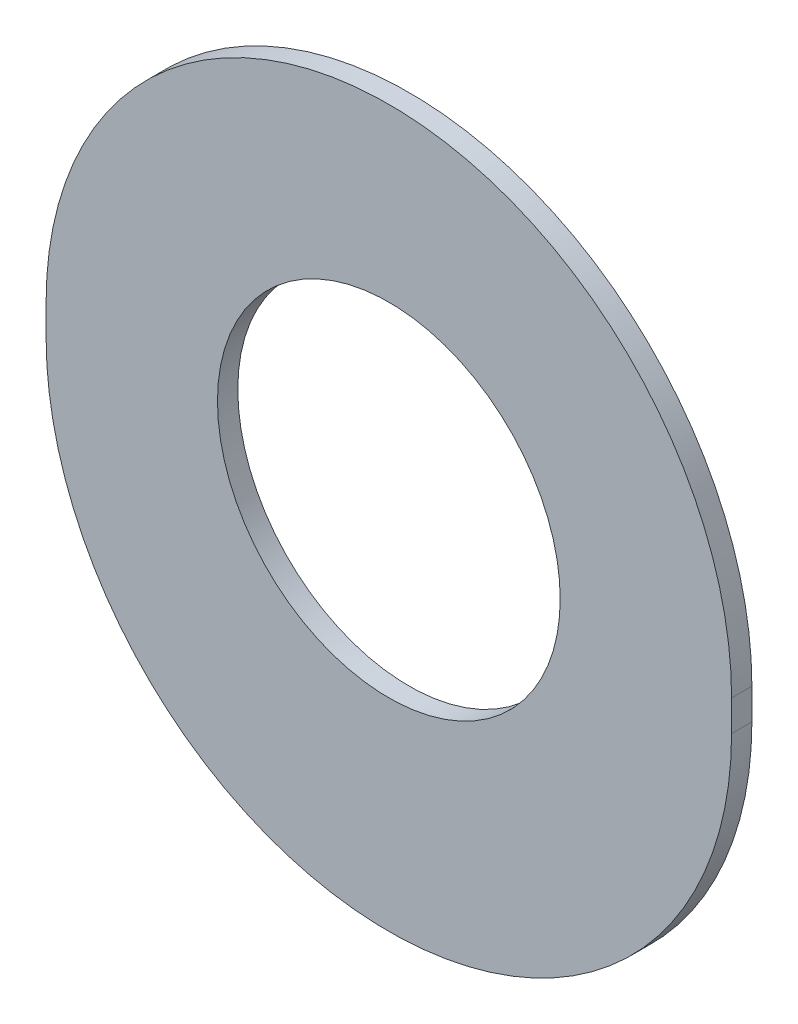
ISO-10303-21;
HEADER;
FILE_DESCRIPTION(('STEP AP214'),'2;1');
FILE_NAME('part.step','',(''),(''),'','','');
FILE_SCHEMA(('AUTOMOTIVE_DESIGN { 1 0 10303 214 1 1 1 1 }'));
ENDSEC;
DATA;
#1=APPLICATION_CONTEXT('core data for automotive mechanical design processes');
#2=APPLICATION_PROTOCOL_DEFINITION('international standard','automotive_design',2000,#1);
#3=PRODUCT_CONTEXT('',#1,'mechanical');
#4=PRODUCT('Part','Part','',(#3));
#5=PRODUCT_RELATED_PRODUCT_CATEGORY('part','',(#4));
#6=PRODUCT_DEFINITION_FORMATION('','',#4);
#7=PRODUCT_DEFINITION_CONTEXT('part definition',#1,'design');
#8=PRODUCT_DEFINITION('design','',#6,#7);
#9=PRODUCT_DEFINITION_SHAPE('','',#8);
#10=(LENGTH_UNIT() NAMED_UNIT(*) SI_UNIT(.MILLI.,.METRE.));
#11=(NAMED_UNIT(*) PLANE_ANGLE_UNIT() SI_UNIT($,.RADIAN.));
#12=(NAMED_UNIT(*) SI_UNIT($,.STERADIAN.) SOLID_ANGLE_UNIT());
#13=UNCERTAINTY_MEASURE_WITH_UNIT(LENGTH_MEASURE(1.E-05),#10,'distance_accuracy_value','');
#14=(GEOMETRIC_REPRESENTATION_CONTEXT(3) GLOBAL_UNCERTAINTY_ASSIGNED_CONTEXT((#13)) GLOBAL_UNIT_ASSIGNED_CONTEXT((#10,
#11,#12)) REPRESENTATION_CONTEXT('',''));
#15=CARTESIAN_POINT('',(0.,0.,0.));
#16=DIRECTION('',(0.,0.,1.));
#17=DIRECTION('',(1.,0.,0.));
#18=AXIS2_PLACEMENT_3D('',#15,#16,#17);
#19=CARTESIAN_POINT('',(83.9999844,95.94589142,0.));
#20=DIRECTION('',(-1.,0.,0.));
#21=DIRECTION('',(0.,1.,0.));
#22=AXIS2_PLACEMENT_3D('',#19,#20,#21);
#23=PLANE('',#22);
#24=DIRECTION('',(0.,1.,0.));
#25=VECTOR('',#24,1.);
#26=CARTESIAN_POINT('',(83.9999844,95.94589142,0.03556));
#27=LINE('',#26,#25);
#28=CARTESIAN_POINT('',(83.9999844,95.94589142,0.03556));
#29=VERTEX_POINT('',#28);
#30=CARTESIAN_POINT('',(83.9999844,96.0000112,0.03556));
#31=VERTEX_POINT('',#30);
#32=EDGE_CURVE('E11',#29,#31,#27,.T.);
#33=ORIENTED_EDGE('',*,*,#32,.F.);
#34=DIRECTION('',(0.,0.,1.));
#35=VECTOR('',#34,1.);
#36=CARTESIAN_POINT('',(83.9999844,95.94589142,0.));
#37=LINE('',#36,#35);
#38=CARTESIAN_POINT('',(83.9999844,95.94589142,0.));
#39=VERTEX_POINT('',#38);
#40=EDGE_CURVE('E24',#39,#29,#37,.T.);
#41=ORIENTED_EDGE('',*,*,#40,.F.);
#42=DIRECTION('',(0.,1.,0.));
#43=VECTOR('',#42,1.);
#44=CARTESIAN_POINT('',(83.9999844,95.94589142,0.));
#45=LINE('',#44,#43);
#46=CARTESIAN_POINT('',(83.9999844,96.0000112,0.));
#47=VERTEX_POINT('',#46);
#48=EDGE_CURVE('E96',#39,#47,#45,.T.);
#49=ORIENTED_EDGE('',*,*,#48,.T.);
#50=DIRECTION('',(0.,0.,1.));
#51=VECTOR('',#50,1.);
#52=CARTESIAN_POINT('',(83.9999844,96.0000112,0.));
#53=LINE('',#52,#51);
#54=EDGE_CURVE('E37',#47,#31,#53,.T.);
#55=ORIENTED_EDGE('',*,*,#54,.T.);
#56=EDGE_LOOP('',(#33,#41,#49,#55));
#57=FACE_BOUND('',#56,.T.);
#58=ADVANCED_FACE('F17',(#57),#23,.F.);
#59=CARTESIAN_POINT('',(83.3999856,95.94589142,0.));
#60=DIRECTION('',(0.,0.,-1.));
#61=DIRECTION('',(-1.,0.,0.));
#62=AXIS2_PLACEMENT_3D('',#59,#60,#61);
#63=CYLINDRICAL_SURFACE('',#62,0.599998799999995);
#64=CARTESIAN_POINT('',(83.3999856,95.94589142,0.03556));
#65=DIRECTION('',(0.,0.,1.));
#66=DIRECTION('',(-1.,0.,0.));
#67=AXIS2_PLACEMENT_3D('',#64,#65,#66);
#68=CIRCLE('',#67,0.599998799999995);
#69=CARTESIAN_POINT('',(82.7999868,95.94589142,0.03556));
#70=VERTEX_POINT('',#69);
#71=EDGE_CURVE('E92',#70,#29,#68,.T.);
#72=ORIENTED_EDGE('',*,*,#71,.F.);
#73=DIRECTION('',(0.,0.,1.));
#74=VECTOR('',#73,1.);
#75=CARTESIAN_POINT('',(82.7999868,95.94589142,0.));
#76=LINE('',#75,#74);
#77=CARTESIAN_POINT('',(82.7999868,95.94589142,0.));
#78=VERTEX_POINT('',#77);
#79=EDGE_CURVE('E90',#78,#70,#76,.T.);
#80=ORIENTED_EDGE('',*,*,#79,.F.);
#81=CARTESIAN_POINT('',(83.3999856,95.94589142,0.));
#82=DIRECTION('',(0.,0.,1.));
#83=DIRECTION('',(-1.,0.,0.));
#84=AXIS2_PLACEMENT_3D('',#81,#82,#83);
#85=CIRCLE('',#84,0.599998799999995);
#86=EDGE_CURVE('E88',#78,#39,#85,.T.);
#87=ORIENTED_EDGE('',*,*,#86,.T.);
#88=ORIENTED_EDGE('',*,*,#40,.T.);
#89=EDGE_LOOP('',(#72,#80,#87,#88));
#90=FACE_BOUND('',#89,.T.);
#91=ADVANCED_FACE('F111',(#90),#63,.T.);
#92=CARTESIAN_POINT('',(83.3999856,96.0000112,0.));
#93=DIRECTION('',(0.,0.,-1.));
#94=DIRECTION('',(1.,0.,0.));
#95=AXIS2_PLACEMENT_3D('',#92,#93,#94);
#96=CYLINDRICAL_SURFACE('',#95,0.599998799999995);
#97=CARTESIAN_POINT('',(83.3999856,96.0000112,0.03556));
#98=DIRECTION('',(0.,0.,1.));
#99=DIRECTION('',(1.,0.,0.));
#100=AXIS2_PLACEMENT_3D('',#97,#98,#99);
#101=CIRCLE('',#100,0.599998799999995);
#102=CARTESIAN_POINT('',(82.7999868,96.0000112,0.03556));
#103=VERTEX_POINT('',#102);
#104=EDGE_CURVE('E85',#31,#103,#101,.T.);
#105=ORIENTED_EDGE('',*,*,#104,.F.);
#106=ORIENTED_EDGE('',*,*,#54,.F.);
#107=CARTESIAN_POINT('',(83.3999856,96.0000112,0.));
#108=DIRECTION('',(0.,0.,1.));
#109=DIRECTION('',(1.,0.,0.));
#110=AXIS2_PLACEMENT_3D('',#107,#108,#109);
#111=CIRCLE('',#110,0.599998799999995);
#112=CARTESIAN_POINT('',(82.7999868,96.0000112,0.));
#113=VERTEX_POINT('',#112);
#114=EDGE_CURVE('E82',#47,#113,#111,.T.);
#115=ORIENTED_EDGE('',*,*,#114,.T.);
#116=DIRECTION('',(0.,0.,1.));
#117=VECTOR('',#116,1.);
#118=CARTESIAN_POINT('',(82.7999868,96.0000112,0.));
#119=LINE('',#118,#117);
#120=EDGE_CURVE('E80',#113,#103,#119,.T.);
#121=ORIENTED_EDGE('',*,*,#120,.T.);
#122=EDGE_LOOP('',(#105,#106,#115,#121));
#123=FACE_BOUND('',#122,.T.);
#124=ADVANCED_FACE('F104',(#123),#96,.T.);
#125=CARTESIAN_POINT('',(82.7999868,96.0000112,0.));
#126=DIRECTION('',(1.,0.,0.));
#127=DIRECTION('',(0.,-1.,0.));
#128=AXIS2_PLACEMENT_3D('',#125,#126,#127);
#129=PLANE('',#128);
#130=DIRECTION('',(0.,-1.,0.));
#131=VECTOR('',#130,1.);
#132=CARTESIAN_POINT('',(82.7999868,96.0000112,0.03556));
#133=LINE('',#132,#131);
#134=EDGE_CURVE('E77',#103,#70,#133,.T.);
#135=ORIENTED_EDGE('',*,*,#134,.F.);
#136=ORIENTED_EDGE('',*,*,#120,.F.);
#137=DIRECTION('',(0.,-1.,0.));
#138=VECTOR('',#137,1.);
#139=CARTESIAN_POINT('',(82.7999868,96.0000112,0.));
#140=LINE('',#139,#138);
#141=EDGE_CURVE('E68',#113,#78,#140,.T.);
#142=ORIENTED_EDGE('',*,*,#141,.T.);
#143=ORIENTED_EDGE('',*,*,#79,.T.);
#144=EDGE_LOOP('',(#135,#136,#142,#143));
#145=FACE_BOUND('',#144,.T.);
#146=ADVANCED_FACE('F110',(#145),#129,.F.);
#147=CARTESIAN_POINT('',(83.3999856,96.0000112,0.));
#148=DIRECTION('',(0.,0.,-1.));
#149=DIRECTION('',(1.,0.,0.));
#150=AXIS2_PLACEMENT_3D('',#147,#148,#149);
#151=CYLINDRICAL_SURFACE('',#150,0.2999994);
#152=DIRECTION('',(0.,0.,1.));
#153=VECTOR('',#152,1.);
#154=CARTESIAN_POINT('',(83.699985,96.0000112,0.));
#155=LINE('',#154,#153);
#156=CARTESIAN_POINT('',(83.699985,96.0000112,0.));
#157=VERTEX_POINT('',#156);
#158=CARTESIAN_POINT('',(83.699985,96.0000112,0.03556));
#159=VERTEX_POINT('',#158);
#160=EDGE_CURVE('E62',#157,#159,#155,.T.);
#161=ORIENTED_EDGE('',*,*,#160,.T.);
#162=CARTESIAN_POINT('',(83.3999856,96.0000112,0.03556));
#163=DIRECTION('',(0.,0.,1.));
#164=DIRECTION('',(1.,0.,0.));
#165=AXIS2_PLACEMENT_3D('',#162,#163,#164);
#166=CIRCLE('',#165,0.2999994);
#167=EDGE_CURVE('E67',#159,#159,#166,.T.);
#168=ORIENTED_EDGE('',*,*,#167,.T.);
#169=ORIENTED_EDGE('',*,*,#160,.F.);
#170=CARTESIAN_POINT('',(83.3999856,96.0000112,0.));
#171=DIRECTION('',(0.,0.,1.));
#172=DIRECTION('',(1.,0.,0.));
#173=AXIS2_PLACEMENT_3D('',#170,#171,#172);
#174=CIRCLE('',#173,0.2999994);
#175=EDGE_CURVE('E65',#157,#157,#174,.T.);
#176=ORIENTED_EDGE('',*,*,#175,.F.);
#177=EDGE_LOOP('',(#161,#168,#169,#176));
#178=FACE_BOUND('',#177,.T.);
#179=ADVANCED_FACE('F64',(#178),#151,.F.);
#180=CARTESIAN_POINT('',(83.9999844,95.94589142,0.));
#181=DIRECTION('',(0.,0.,-1.));
#182=DIRECTION('',(-1.,0.,0.));
#183=AXIS2_PLACEMENT_3D('',#180,#181,#182);
#184=PLANE('',#183);
#185=ORIENTED_EDGE('',*,*,#48,.F.);
#186=ORIENTED_EDGE('',*,*,#86,.F.);
#187=ORIENTED_EDGE('',*,*,#141,.F.);
#188=ORIENTED_EDGE('',*,*,#114,.F.);
#189=EDGE_LOOP('',(#185,#186,#187,#188));
#190=FACE_BOUND('',#189,.T.);
#191=ORIENTED_EDGE('',*,*,#175,.T.);
#192=EDGE_LOOP('',(#191));
#193=FACE_BOUND('',#192,.T.);
#194=ADVANCED_FACE('F71',(#190,#193),#184,.T.);
#195=CARTESIAN_POINT('',(83.9999844,95.94589142,0.03556));
#196=DIRECTION('',(0.,0.,-1.));
#197=DIRECTION('',(-1.,0.,0.));
#198=AXIS2_PLACEMENT_3D('',#195,#196,#197);
#199=PLANE('',#198);
#200=ORIENTED_EDGE('',*,*,#134,.T.);
#201=ORIENTED_EDGE('',*,*,#71,.T.);
#202=ORIENTED_EDGE('',*,*,#32,.T.);
#203=ORIENTED_EDGE('',*,*,#104,.T.);
#204=EDGE_LOOP('',(#200,#201,#202,#203));
#205=FACE_BOUND('',#204,.T.);
#206=ORIENTED_EDGE('',*,*,#167,.F.);
#207=EDGE_LOOP('',(#206));
#208=FACE_BOUND('',#207,.T.);
#209=ADVANCED_FACE('F107',(#205,#208),#199,.F.);
#210=CLOSED_SHELL('',(#58,#91,#124,#146,#179,#194,#209));
#211=MANIFOLD_SOLID_BREP('B1',#210);
#212=ADVANCED_BREP_SHAPE_REPRESENTATION('',(#18,#211),#14);
#213=SHAPE_DEFINITION_REPRESENTATION(#9,#212);
ENDSEC;
END-ISO-10303-21;
